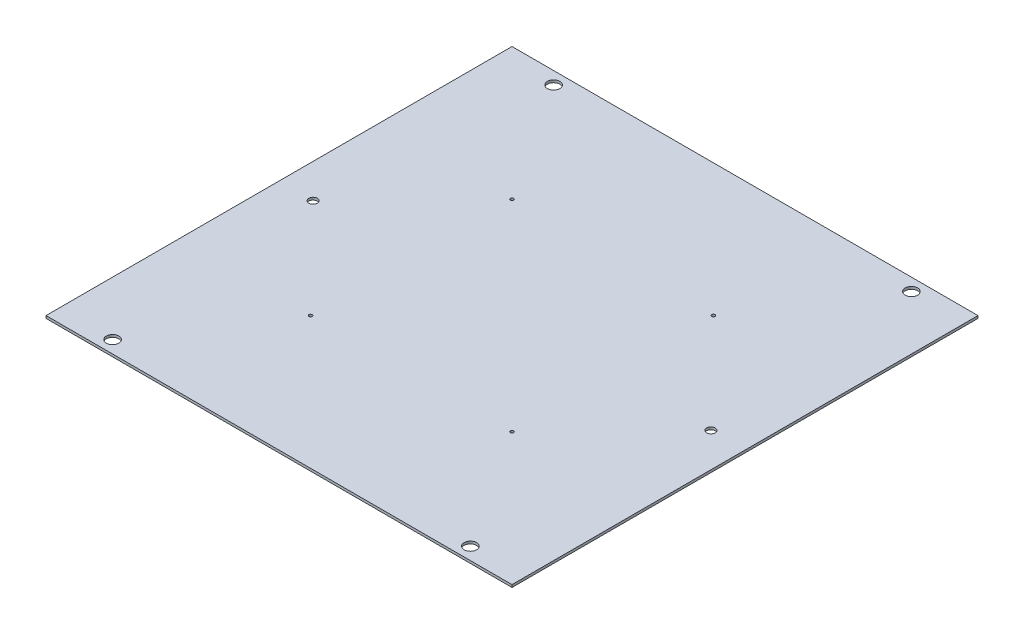
ISO-10303-21;
HEADER;
FILE_DESCRIPTION(('STEP AP214'),'2;1');
FILE_NAME('part.step','',(''),(''),'','','');
FILE_SCHEMA(('AUTOMOTIVE_DESIGN { 1 0 10303 214 1 1 1 1 }'));
ENDSEC;
DATA;
#1=APPLICATION_CONTEXT('core data for automotive mechanical design processes');
#2=APPLICATION_PROTOCOL_DEFINITION('international standard','automotive_design',2000,#1);
#3=PRODUCT_CONTEXT('',#1,'mechanical');
#4=PRODUCT('Part','Part','',(#3));
#5=PRODUCT_RELATED_PRODUCT_CATEGORY('part','',(#4));
#6=PRODUCT_DEFINITION_FORMATION('','',#4);
#7=PRODUCT_DEFINITION_CONTEXT('part definition',#1,'design');
#8=PRODUCT_DEFINITION('design','',#6,#7);
#9=PRODUCT_DEFINITION_SHAPE('','',#8);
#10=(LENGTH_UNIT() NAMED_UNIT(*) SI_UNIT(.MILLI.,.METRE.));
#11=(NAMED_UNIT(*) PLANE_ANGLE_UNIT() SI_UNIT($,.RADIAN.));
#12=(NAMED_UNIT(*) SI_UNIT($,.STERADIAN.) SOLID_ANGLE_UNIT());
#13=UNCERTAINTY_MEASURE_WITH_UNIT(LENGTH_MEASURE(1.E-05),#10,'distance_accuracy_value','');
#14=(GEOMETRIC_REPRESENTATION_CONTEXT(3) GLOBAL_UNCERTAINTY_ASSIGNED_CONTEXT((#13)) GLOBAL_UNIT_ASSIGNED_CONTEXT((#10,
#11,#12)) REPRESENTATION_CONTEXT('',''));
#15=CARTESIAN_POINT('',(0.,0.,0.));
#16=DIRECTION('',(0.,0.,1.));
#17=DIRECTION('',(1.,0.,0.));
#18=AXIS2_PLACEMENT_3D('',#15,#16,#17);
#19=CARTESIAN_POINT('',(0.,3.,0.));
#20=DIRECTION('',(0.,-1.,0.));
#21=DIRECTION('',(0.,0.,-1.));
#22=AXIS2_PLACEMENT_3D('',#19,#20,#21);
#23=PLANE('',#22);
#24=CARTESIAN_POINT('',(65.0000000000001,3.,-15.));
#25=DIRECTION('',(0.,1.,0.));
#26=DIRECTION('',(0.,0.,1.));
#27=AXIS2_PLACEMENT_3D('',#24,#25,#26);
#28=CIRCLE('',#27,7.5);
#29=CARTESIAN_POINT('',(65.0000000000001,3.,-7.5));
#30=VERTEX_POINT('',#29);
#31=EDGE_CURVE('E388',#30,#30,#28,.T.);
#32=ORIENTED_EDGE('',*,*,#31,.F.);
#33=EDGE_LOOP('',(#32));
#34=FACE_BOUND('',#33,.T.);
#35=CARTESIAN_POINT('',(495.,3.,-545.));
#36=DIRECTION('',(0.,1.,0.));
#37=DIRECTION('',(0.,0.,-1.));
#38=AXIS2_PLACEMENT_3D('',#35,#36,#37);
#39=CIRCLE('',#38,7.50000000000001);
#40=CARTESIAN_POINT('',(495.,3.,-552.5));
#41=VERTEX_POINT('',#40);
#42=EDGE_CURVE('E390',#41,#41,#39,.T.);
#43=ORIENTED_EDGE('',*,*,#42,.F.);
#44=EDGE_LOOP('',(#43));
#45=FACE_BOUND('',#44,.T.);
#46=CARTESIAN_POINT('',(65.0000000000001,3.,-545.));
#47=DIRECTION('',(0.,1.,0.));
#48=DIRECTION('',(0.,0.,-1.));
#49=AXIS2_PLACEMENT_3D('',#46,#47,#48);
#50=CIRCLE('',#49,7.5);
#51=CARTESIAN_POINT('',(65.0000000000001,3.,-552.5));
#52=VERTEX_POINT('',#51);
#53=EDGE_CURVE('E396',#52,#52,#50,.T.);
#54=ORIENTED_EDGE('',*,*,#53,.F.);
#55=EDGE_LOOP('',(#54));
#56=FACE_BOUND('',#55,.T.);
#57=CARTESIAN_POINT('',(495.,3.,-15.));
#58=DIRECTION('',(0.,1.,0.));
#59=DIRECTION('',(0.,0.,1.));
#60=AXIS2_PLACEMENT_3D('',#57,#58,#59);
#61=CIRCLE('',#60,7.50000000000001);
#62=CARTESIAN_POINT('',(495.,3.,-7.49999999999999));
#63=VERTEX_POINT('',#62);
#64=EDGE_CURVE('E144',#63,#63,#61,.T.);
#65=ORIENTED_EDGE('',*,*,#64,.F.);
#66=EDGE_LOOP('',(#65));
#67=FACE_BOUND('',#66,.T.);
#68=CARTESIAN_POINT('',(41.,3.,-280.));
#69=DIRECTION('',(0.,1.,0.));
#70=DIRECTION('',(0.,0.,1.));
#71=AXIS2_PLACEMENT_3D('',#68,#69,#70);
#72=CIRCLE('',#71,5.15000000000001);
#73=CARTESIAN_POINT('',(41.,3.,-274.85));
#74=VERTEX_POINT('',#73);
#75=EDGE_CURVE('E134',#74,#74,#72,.T.);
#76=ORIENTED_EDGE('',*,*,#75,.F.);
#77=EDGE_LOOP('',(#76));
#78=FACE_BOUND('',#77,.T.);
#79=CARTESIAN_POINT('',(519.,3.,-280.));
#80=DIRECTION('',(0.,1.,0.));
#81=DIRECTION('',(0.,0.,1.));
#82=AXIS2_PLACEMENT_3D('',#79,#80,#81);
#83=CIRCLE('',#82,5.15000000000001);
#84=CARTESIAN_POINT('',(519.,3.,-274.85));
#85=VERTEX_POINT('',#84);
#86=EDGE_CURVE('E154',#85,#85,#83,.T.);
#87=ORIENTED_EDGE('',*,*,#86,.F.);
#88=EDGE_LOOP('',(#87));
#89=FACE_BOUND('',#88,.T.);
#90=CARTESIAN_POINT('',(159.,3.,-159.));
#91=DIRECTION('',(0.,1.,0.));
#92=DIRECTION('',(0.,0.,1.));
#93=AXIS2_PLACEMENT_3D('',#90,#91,#92);
#94=CIRCLE('',#93,2.);
#95=CARTESIAN_POINT('',(159.,3.,-157.));
#96=VERTEX_POINT('',#95);
#97=EDGE_CURVE('E138',#96,#96,#94,.T.);
#98=ORIENTED_EDGE('',*,*,#97,.F.);
#99=EDGE_LOOP('',(#98));
#100=FACE_BOUND('',#99,.T.);
#101=CARTESIAN_POINT('',(401.,3.,-159.));
#102=DIRECTION('',(0.,1.,0.));
#103=DIRECTION('',(0.,0.,1.));
#104=AXIS2_PLACEMENT_3D('',#101,#102,#103);
#105=CIRCLE('',#104,2.);
#106=CARTESIAN_POINT('',(401.,3.,-157.));
#107=VERTEX_POINT('',#106);
#108=EDGE_CURVE('E174',#107,#107,#105,.T.);
#109=ORIENTED_EDGE('',*,*,#108,.F.);
#110=EDGE_LOOP('',(#109));
#111=FACE_BOUND('',#110,.T.);
#112=CARTESIAN_POINT('',(401.,3.,-401.));
#113=DIRECTION('',(0.,1.,0.));
#114=DIRECTION('',(0.,0.,1.));
#115=AXIS2_PLACEMENT_3D('',#112,#113,#114);
#116=CIRCLE('',#115,2.);
#117=CARTESIAN_POINT('',(401.,3.,-399.));
#118=VERTEX_POINT('',#117);
#119=EDGE_CURVE('E182',#118,#118,#116,.T.);
#120=ORIENTED_EDGE('',*,*,#119,.F.);
#121=EDGE_LOOP('',(#120));
#122=FACE_BOUND('',#121,.T.);
#123=DIRECTION('',(0.,0.,1.));
#124=VECTOR('',#123,1.);
#125=CARTESIAN_POINT('',(0.,3.,0.));
#126=LINE('',#125,#124);
#127=CARTESIAN_POINT('',(0.,3.,-560.));
#128=VERTEX_POINT('',#127);
#129=CARTESIAN_POINT('',(0.,3.,0.));
#130=VERTEX_POINT('',#129);
#131=EDGE_CURVE('E97',#128,#130,#126,.T.);
#132=ORIENTED_EDGE('',*,*,#131,.T.);
#133=DIRECTION('',(1.,0.,0.));
#134=VECTOR('',#133,1.);
#135=CARTESIAN_POINT('',(0.,3.,0.));
#136=LINE('',#135,#134);
#137=CARTESIAN_POINT('',(560.,3.,0.));
#138=VERTEX_POINT('',#137);
#139=EDGE_CURVE('E92',#130,#138,#136,.T.);
#140=ORIENTED_EDGE('',*,*,#139,.T.);
#141=DIRECTION('',(0.,0.,-1.));
#142=VECTOR('',#141,1.);
#143=CARTESIAN_POINT('',(560.,3.,0.));
#144=LINE('',#143,#142);
#145=CARTESIAN_POINT('',(560.,3.,-560.));
#146=VERTEX_POINT('',#145);
#147=EDGE_CURVE('E95',#138,#146,#144,.T.);
#148=ORIENTED_EDGE('',*,*,#147,.T.);
#149=DIRECTION('',(-1.,0.,0.));
#150=VECTOR('',#149,1.);
#151=CARTESIAN_POINT('',(0.,3.,-560.));
#152=LINE('',#151,#150);
#153=EDGE_CURVE('E62',#146,#128,#152,.T.);
#154=ORIENTED_EDGE('',*,*,#153,.T.);
#155=EDGE_LOOP('',(#132,#140,#148,#154));
#156=FACE_BOUND('',#155,.T.);
#157=CARTESIAN_POINT('',(159.,3.,-401.));
#158=DIRECTION('',(0.,1.,0.));
#159=DIRECTION('',(0.,0.,1.));
#160=AXIS2_PLACEMENT_3D('',#157,#158,#159);
#161=CIRCLE('',#160,2.);
#162=CARTESIAN_POINT('',(159.,3.,-399.));
#163=VERTEX_POINT('',#162);
#164=EDGE_CURVE('E190',#163,#163,#161,.T.);
#165=ORIENTED_EDGE('',*,*,#164,.F.);
#166=EDGE_LOOP('',(#165));
#167=FACE_BOUND('',#166,.T.);
#168=ADVANCED_FACE('F42',(#34,#45,#56,#67,#78,#89,#100,#111,#122,#156,#167),#23,.F.);
#169=CARTESIAN_POINT('',(0.,0.,0.));
#170=DIRECTION('',(0.,-1.,0.));
#171=DIRECTION('',(0.,0.,-1.));
#172=AXIS2_PLACEMENT_3D('',#169,#170,#171);
#173=PLANE('',#172);
#174=CARTESIAN_POINT('',(65.0000000000001,0.,-15.));
#175=DIRECTION('',(0.,-1.,0.));
#176=DIRECTION('',(0.,0.,-1.));
#177=AXIS2_PLACEMENT_3D('',#174,#175,#176);
#178=CIRCLE('',#177,7.5);
#179=CARTESIAN_POINT('',(65.0000000000001,0.,-22.5));
#180=VERTEX_POINT('',#179);
#181=EDGE_CURVE('E46',#180,#180,#178,.T.);
#182=ORIENTED_EDGE('',*,*,#181,.F.);
#183=EDGE_LOOP('',(#182));
#184=FACE_BOUND('',#183,.T.);
#185=CARTESIAN_POINT('',(495.,0.,-545.));
#186=DIRECTION('',(0.,-1.,0.));
#187=DIRECTION('',(0.,0.,-1.));
#188=AXIS2_PLACEMENT_3D('',#185,#186,#187);
#189=CIRCLE('',#188,7.50000000000001);
#190=CARTESIAN_POINT('',(495.,0.,-552.5));
#191=VERTEX_POINT('',#190);
#192=EDGE_CURVE('E147',#191,#191,#189,.T.);
#193=ORIENTED_EDGE('',*,*,#192,.F.);
#194=EDGE_LOOP('',(#193));
#195=FACE_BOUND('',#194,.T.);
#196=CARTESIAN_POINT('',(65.0000000000001,0.,-545.));
#197=DIRECTION('',(0.,-1.,0.));
#198=DIRECTION('',(0.,0.,-1.));
#199=AXIS2_PLACEMENT_3D('',#196,#197,#198);
#200=CIRCLE('',#199,7.5);
#201=CARTESIAN_POINT('',(65.0000000000001,0.,-552.5));
#202=VERTEX_POINT('',#201);
#203=EDGE_CURVE('E143',#202,#202,#200,.T.);
#204=ORIENTED_EDGE('',*,*,#203,.F.);
#205=EDGE_LOOP('',(#204));
#206=FACE_BOUND('',#205,.T.);
#207=CARTESIAN_POINT('',(495.,0.,-15.));
#208=DIRECTION('',(0.,-1.,0.));
#209=DIRECTION('',(0.,0.,-1.));
#210=AXIS2_PLACEMENT_3D('',#207,#208,#209);
#211=CIRCLE('',#210,7.50000000000001);
#212=CARTESIAN_POINT('',(495.,0.,-22.5));
#213=VERTEX_POINT('',#212);
#214=EDGE_CURVE('E139',#213,#213,#211,.T.);
#215=ORIENTED_EDGE('',*,*,#214,.F.);
#216=EDGE_LOOP('',(#215));
#217=FACE_BOUND('',#216,.T.);
#218=CARTESIAN_POINT('',(41.,0.,-280.));
#219=DIRECTION('',(0.,-1.,0.));
#220=DIRECTION('',(0.,0.,-1.));
#221=AXIS2_PLACEMENT_3D('',#218,#219,#220);
#222=CIRCLE('',#221,5.15000000000001);
#223=CARTESIAN_POINT('',(41.,0.,-285.15));
#224=VERTEX_POINT('',#223);
#225=EDGE_CURVE('E133',#224,#224,#222,.T.);
#226=ORIENTED_EDGE('',*,*,#225,.F.);
#227=EDGE_LOOP('',(#226));
#228=FACE_BOUND('',#227,.T.);
#229=CARTESIAN_POINT('',(519.,0.,-280.));
#230=DIRECTION('',(0.,-1.,0.));
#231=DIRECTION('',(0.,0.,-1.));
#232=AXIS2_PLACEMENT_3D('',#229,#230,#231);
#233=CIRCLE('',#232,5.15000000000001);
#234=CARTESIAN_POINT('',(519.,0.,-285.15));
#235=VERTEX_POINT('',#234);
#236=EDGE_CURVE('E129',#235,#235,#233,.T.);
#237=ORIENTED_EDGE('',*,*,#236,.F.);
#238=EDGE_LOOP('',(#237));
#239=FACE_BOUND('',#238,.T.);
#240=CARTESIAN_POINT('',(159.,0.,-159.));
#241=DIRECTION('',(0.,1.,0.));
#242=DIRECTION('',(0.,0.,1.));
#243=AXIS2_PLACEMENT_3D('',#240,#241,#242);
#244=CIRCLE('',#243,2.);
#245=CARTESIAN_POINT('',(159.,0.,-157.));
#246=VERTEX_POINT('',#245);
#247=EDGE_CURVE('E170',#246,#246,#244,.T.);
#248=ORIENTED_EDGE('',*,*,#247,.T.);
#249=EDGE_LOOP('',(#248));
#250=FACE_BOUND('',#249,.T.);
#251=CARTESIAN_POINT('',(401.,0.,-159.));
#252=DIRECTION('',(0.,1.,0.));
#253=DIRECTION('',(0.,0.,1.));
#254=AXIS2_PLACEMENT_3D('',#251,#252,#253);
#255=CIRCLE('',#254,2.);
#256=CARTESIAN_POINT('',(401.,0.,-157.));
#257=VERTEX_POINT('',#256);
#258=EDGE_CURVE('E178',#257,#257,#255,.T.);
#259=ORIENTED_EDGE('',*,*,#258,.T.);
#260=EDGE_LOOP('',(#259));
#261=FACE_BOUND('',#260,.T.);
#262=CARTESIAN_POINT('',(401.,0.,-401.));
#263=DIRECTION('',(0.,1.,0.));
#264=DIRECTION('',(0.,0.,1.));
#265=AXIS2_PLACEMENT_3D('',#262,#263,#264);
#266=CIRCLE('',#265,2.);
#267=CARTESIAN_POINT('',(401.,0.,-399.));
#268=VERTEX_POINT('',#267);
#269=EDGE_CURVE('E186',#268,#268,#266,.T.);
#270=ORIENTED_EDGE('',*,*,#269,.T.);
#271=EDGE_LOOP('',(#270));
#272=FACE_BOUND('',#271,.T.);
#273=DIRECTION('',(0.,0.,1.));
#274=VECTOR('',#273,1.);
#275=CARTESIAN_POINT('',(0.,0.,0.));
#276=LINE('',#275,#274);
#277=CARTESIAN_POINT('',(0.,0.,-560.));
#278=VERTEX_POINT('',#277);
#279=CARTESIAN_POINT('',(0.,0.,0.));
#280=VERTEX_POINT('',#279);
#281=EDGE_CURVE('E114',#278,#280,#276,.T.);
#282=ORIENTED_EDGE('',*,*,#281,.F.);
#283=DIRECTION('',(-1.,0.,0.));
#284=VECTOR('',#283,1.);
#285=CARTESIAN_POINT('',(0.,0.,-560.));
#286=LINE('',#285,#284);
#287=CARTESIAN_POINT('',(560.,0.,-560.));
#288=VERTEX_POINT('',#287);
#289=EDGE_CURVE('E85',#288,#278,#286,.T.);
#290=ORIENTED_EDGE('',*,*,#289,.F.);
#291=DIRECTION('',(0.,0.,-1.));
#292=VECTOR('',#291,1.);
#293=CARTESIAN_POINT('',(560.,0.,0.));
#294=LINE('',#293,#292);
#295=CARTESIAN_POINT('',(560.,0.,0.));
#296=VERTEX_POINT('',#295);
#297=EDGE_CURVE('E79',#296,#288,#294,.T.);
#298=ORIENTED_EDGE('',*,*,#297,.F.);
#299=DIRECTION('',(1.,0.,0.));
#300=VECTOR('',#299,1.);
#301=CARTESIAN_POINT('',(0.,0.,0.));
#302=LINE('',#301,#300);
#303=EDGE_CURVE('E102',#280,#296,#302,.T.);
#304=ORIENTED_EDGE('',*,*,#303,.F.);
#305=EDGE_LOOP('',(#282,#290,#298,#304));
#306=FACE_BOUND('',#305,.T.);
#307=CARTESIAN_POINT('',(159.,0.,-401.));
#308=DIRECTION('',(0.,1.,0.));
#309=DIRECTION('',(0.,0.,1.));
#310=AXIS2_PLACEMENT_3D('',#307,#308,#309);
#311=CIRCLE('',#310,2.);
#312=CARTESIAN_POINT('',(159.,0.,-399.));
#313=VERTEX_POINT('',#312);
#314=EDGE_CURVE('E118',#313,#313,#311,.T.);
#315=ORIENTED_EDGE('',*,*,#314,.T.);
#316=EDGE_LOOP('',(#315));
#317=FACE_BOUND('',#316,.T.);
#318=ADVANCED_FACE('F199',(#184,#195,#206,#217,#228,#239,#250,#261,#272,#306,#317),#173,.T.);
#319=CARTESIAN_POINT('',(0.,3.,0.));
#320=DIRECTION('',(1.,0.,0.));
#321=DIRECTION('',(0.,0.,-1.));
#322=AXIS2_PLACEMENT_3D('',#319,#320,#321);
#323=PLANE('',#322);
#324=ORIENTED_EDGE('',*,*,#281,.T.);
#325=DIRECTION('',(0.,-1.,0.));
#326=VECTOR('',#325,1.);
#327=CARTESIAN_POINT('',(0.,3.,0.));
#328=LINE('',#327,#326);
#329=EDGE_CURVE('E11',#130,#280,#328,.T.);
#330=ORIENTED_EDGE('',*,*,#329,.F.);
#331=ORIENTED_EDGE('',*,*,#131,.F.);
#332=DIRECTION('',(0.,-1.,0.));
#333=VECTOR('',#332,1.);
#334=CARTESIAN_POINT('',(0.,3.,-560.));
#335=LINE('',#334,#333);
#336=EDGE_CURVE('E110',#128,#278,#335,.T.);
#337=ORIENTED_EDGE('',*,*,#336,.T.);
#338=EDGE_LOOP('',(#324,#330,#331,#337));
#339=FACE_BOUND('',#338,.T.);
#340=ADVANCED_FACE('F44',(#339),#323,.F.);
#341=CARTESIAN_POINT('',(0.,3.,0.));
#342=DIRECTION('',(0.,0.,-1.));
#343=DIRECTION('',(-1.,0.,0.));
#344=AXIS2_PLACEMENT_3D('',#341,#342,#343);
#345=PLANE('',#344);
#346=ORIENTED_EDGE('',*,*,#303,.T.);
#347=DIRECTION('',(0.,-1.,0.));
#348=VECTOR('',#347,1.);
#349=CARTESIAN_POINT('',(560.,3.,0.));
#350=LINE('',#349,#348);
#351=EDGE_CURVE('E53',#138,#296,#350,.T.);
#352=ORIENTED_EDGE('',*,*,#351,.F.);
#353=ORIENTED_EDGE('',*,*,#139,.F.);
#354=ORIENTED_EDGE('',*,*,#329,.T.);
#355=EDGE_LOOP('',(#346,#352,#353,#354));
#356=FACE_BOUND('',#355,.T.);
#357=ADVANCED_FACE('F101',(#356),#345,.F.);
#358=CARTESIAN_POINT('',(560.,3.,0.));
#359=DIRECTION('',(-1.,0.,0.));
#360=DIRECTION('',(0.,0.,1.));
#361=AXIS2_PLACEMENT_3D('',#358,#359,#360);
#362=PLANE('',#361);
#363=ORIENTED_EDGE('',*,*,#297,.T.);
#364=DIRECTION('',(0.,-1.,0.));
#365=VECTOR('',#364,1.);
#366=CARTESIAN_POINT('',(560.,3.,-560.));
#367=LINE('',#366,#365);
#368=EDGE_CURVE('E104',#146,#288,#367,.T.);
#369=ORIENTED_EDGE('',*,*,#368,.F.);
#370=ORIENTED_EDGE('',*,*,#147,.F.);
#371=ORIENTED_EDGE('',*,*,#351,.T.);
#372=EDGE_LOOP('',(#363,#369,#370,#371));
#373=FACE_BOUND('',#372,.T.);
#374=ADVANCED_FACE('F106',(#373),#362,.F.);
#375=CARTESIAN_POINT('',(0.,3.,-560.));
#376=DIRECTION('',(0.,0.,1.));
#377=DIRECTION('',(1.,0.,0.));
#378=AXIS2_PLACEMENT_3D('',#375,#376,#377);
#379=PLANE('',#378);
#380=ORIENTED_EDGE('',*,*,#289,.T.);
#381=ORIENTED_EDGE('',*,*,#336,.F.);
#382=ORIENTED_EDGE('',*,*,#153,.F.);
#383=ORIENTED_EDGE('',*,*,#368,.T.);
#384=EDGE_LOOP('',(#380,#381,#382,#383));
#385=FACE_BOUND('',#384,.T.);
#386=ADVANCED_FACE('F205',(#385),#379,.F.);
#387=CARTESIAN_POINT('',(159.,3.,-401.));
#388=DIRECTION('',(0.,1.,0.));
#389=DIRECTION('',(0.,0.,1.));
#390=AXIS2_PLACEMENT_3D('',#387,#388,#389);
#391=CYLINDRICAL_SURFACE('',#390,2.);
#392=ORIENTED_EDGE('',*,*,#314,.F.);
#393=EDGE_LOOP('',(#392));
#394=FACE_BOUND('',#393,.T.);
#395=ORIENTED_EDGE('',*,*,#164,.T.);
#396=EDGE_LOOP('',(#395));
#397=FACE_BOUND('',#396,.T.);
#398=ADVANCED_FACE('F201',(#394,#397),#391,.F.);
#399=CARTESIAN_POINT('',(401.,3.,-401.));
#400=DIRECTION('',(0.,1.,0.));
#401=DIRECTION('',(0.,0.,1.));
#402=AXIS2_PLACEMENT_3D('',#399,#400,#401);
#403=CYLINDRICAL_SURFACE('',#402,2.);
#404=ORIENTED_EDGE('',*,*,#269,.F.);
#405=EDGE_LOOP('',(#404));
#406=FACE_BOUND('',#405,.T.);
#407=ORIENTED_EDGE('',*,*,#119,.T.);
#408=EDGE_LOOP('',(#407));
#409=FACE_BOUND('',#408,.T.);
#410=ADVANCED_FACE('F204',(#406,#409),#403,.F.);
#411=CARTESIAN_POINT('',(401.,3.,-159.));
#412=DIRECTION('',(0.,1.,0.));
#413=DIRECTION('',(0.,0.,1.));
#414=AXIS2_PLACEMENT_3D('',#411,#412,#413);
#415=CYLINDRICAL_SURFACE('',#414,2.);
#416=ORIENTED_EDGE('',*,*,#258,.F.);
#417=EDGE_LOOP('',(#416));
#418=FACE_BOUND('',#417,.T.);
#419=ORIENTED_EDGE('',*,*,#108,.T.);
#420=EDGE_LOOP('',(#419));
#421=FACE_BOUND('',#420,.T.);
#422=ADVANCED_FACE('F273',(#418,#421),#415,.F.);
#423=CARTESIAN_POINT('',(159.,3.,-159.));
#424=DIRECTION('',(0.,1.,0.));
#425=DIRECTION('',(0.,0.,1.));
#426=AXIS2_PLACEMENT_3D('',#423,#424,#425);
#427=CYLINDRICAL_SURFACE('',#426,2.);
#428=ORIENTED_EDGE('',*,*,#247,.F.);
#429=EDGE_LOOP('',(#428));
#430=FACE_BOUND('',#429,.T.);
#431=ORIENTED_EDGE('',*,*,#97,.T.);
#432=EDGE_LOOP('',(#431));
#433=FACE_BOUND('',#432,.T.);
#434=ADVANCED_FACE('F283',(#430,#433),#427,.F.);
#435=CARTESIAN_POINT('',(519.,-7.,-280.));
#436=DIRECTION('',(0.,1.,0.));
#437=DIRECTION('',(0.,0.,1.));
#438=AXIS2_PLACEMENT_3D('',#435,#436,#437);
#439=CYLINDRICAL_SURFACE('',#438,5.15000000000001);
#440=ORIENTED_EDGE('',*,*,#236,.T.);
#441=EDGE_LOOP('',(#440));
#442=FACE_BOUND('',#441,.T.);
#443=ORIENTED_EDGE('',*,*,#86,.T.);
#444=EDGE_LOOP('',(#443));
#445=FACE_BOUND('',#444,.T.);
#446=ADVANCED_FACE('F294',(#442,#445),#439,.F.);
#447=CARTESIAN_POINT('',(41.,-7.,-280.));
#448=DIRECTION('',(0.,1.,0.));
#449=DIRECTION('',(0.,0.,1.));
#450=AXIS2_PLACEMENT_3D('',#447,#448,#449);
#451=CYLINDRICAL_SURFACE('',#450,5.15000000000001);
#452=ORIENTED_EDGE('',*,*,#225,.T.);
#453=EDGE_LOOP('',(#452));
#454=FACE_BOUND('',#453,.T.);
#455=ORIENTED_EDGE('',*,*,#75,.T.);
#456=EDGE_LOOP('',(#455));
#457=FACE_BOUND('',#456,.T.);
#458=ADVANCED_FACE('F304',(#454,#457),#451,.F.);
#459=CARTESIAN_POINT('',(495.,-7.,-15.));
#460=DIRECTION('',(0.,1.,0.));
#461=DIRECTION('',(0.,0.,1.));
#462=AXIS2_PLACEMENT_3D('',#459,#460,#461);
#463=CYLINDRICAL_SURFACE('',#462,7.50000000000001);
#464=ORIENTED_EDGE('',*,*,#214,.T.);
#465=EDGE_LOOP('',(#464));
#466=FACE_BOUND('',#465,.T.);
#467=ORIENTED_EDGE('',*,*,#64,.T.);
#468=EDGE_LOOP('',(#467));
#469=FACE_BOUND('',#468,.T.);
#470=ADVANCED_FACE('F314',(#466,#469),#463,.F.);
#471=CARTESIAN_POINT('',(65.0000000000001,-7.,-545.));
#472=DIRECTION('',(0.,1.,0.));
#473=DIRECTION('',(0.,0.,1.));
#474=AXIS2_PLACEMENT_3D('',#471,#472,#473);
#475=CYLINDRICAL_SURFACE('',#474,7.5);
#476=ORIENTED_EDGE('',*,*,#203,.T.);
#477=EDGE_LOOP('',(#476));
#478=FACE_BOUND('',#477,.T.);
#479=ORIENTED_EDGE('',*,*,#53,.T.);
#480=EDGE_LOOP('',(#479));
#481=FACE_BOUND('',#480,.T.);
#482=ADVANCED_FACE('F326',(#478,#481),#475,.F.);
#483=CARTESIAN_POINT('',(495.,-7.,-545.));
#484=DIRECTION('',(0.,1.,0.));
#485=DIRECTION('',(0.,0.,1.));
#486=AXIS2_PLACEMENT_3D('',#483,#484,#485);
#487=CYLINDRICAL_SURFACE('',#486,7.50000000000001);
#488=ORIENTED_EDGE('',*,*,#192,.T.);
#489=EDGE_LOOP('',(#488));
#490=FACE_BOUND('',#489,.T.);
#491=ORIENTED_EDGE('',*,*,#42,.T.);
#492=EDGE_LOOP('',(#491));
#493=FACE_BOUND('',#492,.T.);
#494=ADVANCED_FACE('F333',(#490,#493),#487,.F.);
#495=CARTESIAN_POINT('',(65.0000000000001,-7.,-15.));
#496=DIRECTION('',(0.,1.,0.));
#497=DIRECTION('',(0.,0.,1.));
#498=AXIS2_PLACEMENT_3D('',#495,#496,#497);
#499=CYLINDRICAL_SURFACE('',#498,7.5);
#500=ORIENTED_EDGE('',*,*,#181,.T.);
#501=EDGE_LOOP('',(#500));
#502=FACE_BOUND('',#501,.T.);
#503=ORIENTED_EDGE('',*,*,#31,.T.);
#504=EDGE_LOOP('',(#503));
#505=FACE_BOUND('',#504,.T.);
#506=ADVANCED_FACE('F341',(#502,#505),#499,.F.);
#507=CLOSED_SHELL('',(#168,#318,#340,#357,#374,#386,#398,#410,#422,#434,#446,#458,#470,#482,
#494,#506));
#508=MANIFOLD_SOLID_BREP('B2',#507);
#509=ADVANCED_BREP_SHAPE_REPRESENTATION('',(#18,#508),#14);
#510=SHAPE_DEFINITION_REPRESENTATION(#9,#509);
ENDSEC;
END-ISO-10303-21;
